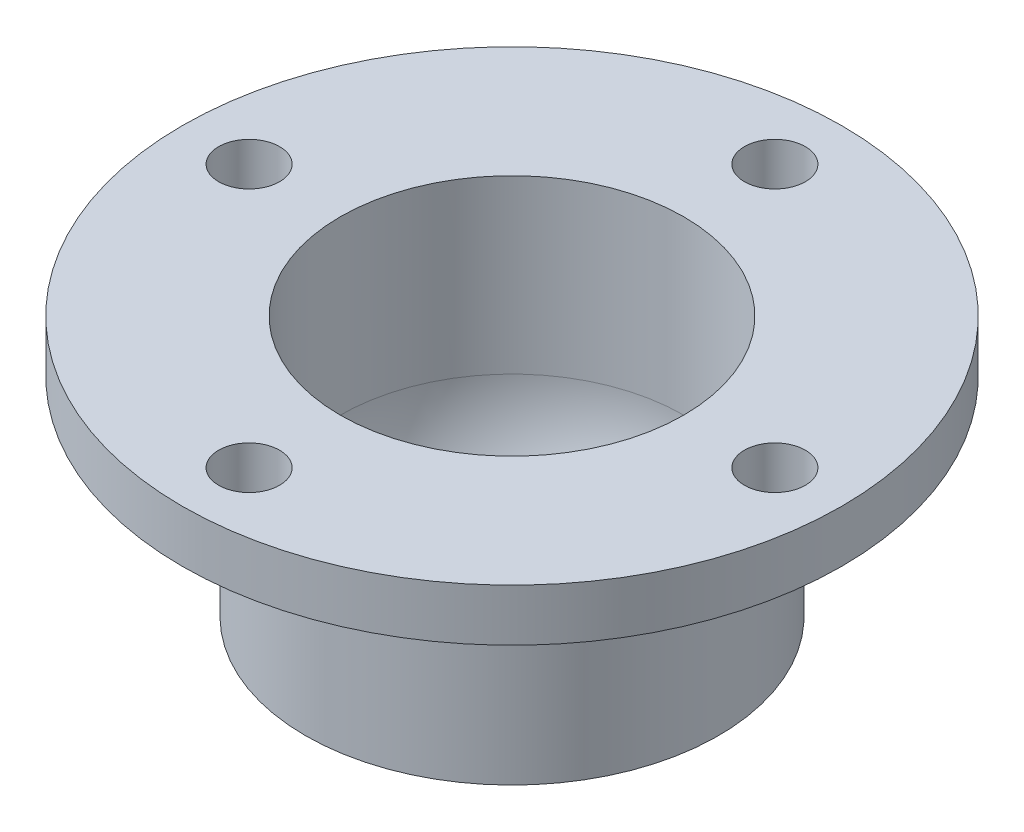
ISO-10303-21;
HEADER;
FILE_DESCRIPTION(('STEP AP214'),'2;1');
FILE_NAME('part.step','',(''),(''),'','','');
FILE_SCHEMA(('AUTOMOTIVE_DESIGN { 1 0 10303 214 1 1 1 1 }'));
ENDSEC;
DATA;
#1=APPLICATION_CONTEXT('core data for automotive mechanical design processes');
#2=APPLICATION_PROTOCOL_DEFINITION('international standard','automotive_design',2000,#1);
#3=PRODUCT_CONTEXT('',#1,'mechanical');
#4=PRODUCT('Part','Part','',(#3));
#5=PRODUCT_RELATED_PRODUCT_CATEGORY('part','',(#4));
#6=PRODUCT_DEFINITION_FORMATION('','',#4);
#7=PRODUCT_DEFINITION_CONTEXT('part definition',#1,'design');
#8=PRODUCT_DEFINITION('design','',#6,#7);
#9=PRODUCT_DEFINITION_SHAPE('','',#8);
#10=(LENGTH_UNIT() NAMED_UNIT(*) SI_UNIT(.MILLI.,.METRE.));
#11=(NAMED_UNIT(*) PLANE_ANGLE_UNIT() SI_UNIT($,.RADIAN.));
#12=(NAMED_UNIT(*) SI_UNIT($,.STERADIAN.) SOLID_ANGLE_UNIT());
#13=UNCERTAINTY_MEASURE_WITH_UNIT(LENGTH_MEASURE(1.E-05),#10,'distance_accuracy_value','');
#14=(GEOMETRIC_REPRESENTATION_CONTEXT(3) GLOBAL_UNCERTAINTY_ASSIGNED_CONTEXT((#13)) GLOBAL_UNIT_ASSIGNED_CONTEXT((#10,
#11,#12)) REPRESENTATION_CONTEXT('',''));
#15=CARTESIAN_POINT('',(0.,0.,0.));
#16=DIRECTION('',(0.,0.,1.));
#17=DIRECTION('',(1.,0.,0.));
#18=AXIS2_PLACEMENT_3D('',#15,#16,#17);
#19=CARTESIAN_POINT('',(0.,15.,0.));
#20=DIRECTION('',(0.,-1.,0.));
#21=DIRECTION('',(0.,0.,-1.));
#22=AXIS2_PLACEMENT_3D('',#19,#20,#21);
#23=CYLINDRICAL_SURFACE('',#22,11.9);
#24=CARTESIAN_POINT('',(0.,0.,0.));
#25=DIRECTION('',(0.,1.,0.));
#26=DIRECTION('',(0.,0.,1.));
#27=AXIS2_PLACEMENT_3D('',#24,#25,#26);
#28=CIRCLE('',#27,11.9);
#29=CARTESIAN_POINT('',(0.,0.,11.9));
#30=VERTEX_POINT('',#29);
#31=EDGE_CURVE('E45',#30,#30,#28,.T.);
#32=ORIENTED_EDGE('',*,*,#31,.T.);
#33=EDGE_LOOP('',(#32));
#34=FACE_BOUND('',#33,.T.);
#35=CARTESIAN_POINT('',(0.,12.,0.));
#36=DIRECTION('',(0.,1.,0.));
#37=DIRECTION('',(0.,0.,1.));
#38=AXIS2_PLACEMENT_3D('',#35,#36,#37);
#39=CIRCLE('',#38,11.9);
#40=CARTESIAN_POINT('',(0.,12.,11.9));
#41=VERTEX_POINT('',#40);
#42=EDGE_CURVE('E11',#41,#41,#39,.T.);
#43=ORIENTED_EDGE('',*,*,#42,.F.);
#44=EDGE_LOOP('',(#43));
#45=FACE_BOUND('',#44,.T.);
#46=ADVANCED_FACE('F39',(#34,#45),#23,.T.);
#47=CARTESIAN_POINT('',(0.,0.,0.));
#48=DIRECTION('',(0.,1.,0.));
#49=DIRECTION('',(0.,0.,1.));
#50=AXIS2_PLACEMENT_3D('',#47,#48,#49);
#51=PLANE('',#50);
#52=ORIENTED_EDGE('',*,*,#31,.F.);
#53=EDGE_LOOP('',(#52));
#54=FACE_BOUND('',#53,.T.);
#55=CARTESIAN_POINT('',(0.,0.,0.));
#56=DIRECTION('',(0.,1.,0.));
#57=DIRECTION('',(0.,0.,1.));
#58=AXIS2_PLACEMENT_3D('',#55,#56,#57);
#59=CIRCLE('',#58,8.48528137423857);
#60=CARTESIAN_POINT('',(0.,0.,8.48528137423857));
#61=VERTEX_POINT('',#60);
#62=EDGE_CURVE('E53',#61,#61,#59,.F.);
#63=ORIENTED_EDGE('',*,*,#62,.F.);
#64=EDGE_LOOP('',(#63));
#65=FACE_BOUND('',#64,.T.);
#66=ADVANCED_FACE('F131',(#54,#65),#51,.F.);
#67=CARTESIAN_POINT('',(0.,15.,0.));
#68=DIRECTION('',(0.,-1.,0.));
#69=DIRECTION('',(0.,0.,-1.));
#70=AXIS2_PLACEMENT_3D('',#67,#68,#69);
#71=CYLINDRICAL_SURFACE('',#70,9.9);
#72=CARTESIAN_POINT('',(0.,15.,0.));
#73=DIRECTION('',(0.,1.,0.));
#74=DIRECTION('',(0.,0.,1.));
#75=AXIS2_PLACEMENT_3D('',#72,#73,#74);
#76=CIRCLE('',#75,9.9);
#77=CARTESIAN_POINT('',(0.,15.,9.9));
#78=VERTEX_POINT('',#77);
#79=EDGE_CURVE('E49',#78,#78,#76,.T.);
#80=ORIENTED_EDGE('',*,*,#79,.T.);
#81=EDGE_LOOP('',(#80));
#82=FACE_BOUND('',#81,.T.);
#83=CARTESIAN_POINT('',(0.,5.1,0.));
#84=DIRECTION('',(0.,-1.,0.));
#85=DIRECTION('',(0.,0.,-1.));
#86=AXIS2_PLACEMENT_3D('',#83,#84,#85);
#87=CIRCLE('',#86,9.9);
#88=CARTESIAN_POINT('',(0.,5.1,-9.9));
#89=VERTEX_POINT('',#88);
#90=EDGE_CURVE('E58',#89,#89,#87,.F.);
#91=ORIENTED_EDGE('',*,*,#90,.F.);
#92=EDGE_LOOP('',(#91));
#93=FACE_BOUND('',#92,.T.);
#94=ADVANCED_FACE('F106',(#82,#93),#71,.F.);
#95=CARTESIAN_POINT('',(0.,15.,0.));
#96=DIRECTION('',(0.,1.,0.));
#97=DIRECTION('',(0.,0.,1.));
#98=AXIS2_PLACEMENT_3D('',#95,#96,#97);
#99=PLANE('',#98);
#100=CARTESIAN_POINT('',(15.15,15.,0.));
#101=DIRECTION('',(0.,1.,0.));
#102=DIRECTION('',(0.,0.,1.));
#103=AXIS2_PLACEMENT_3D('',#100,#101,#102);
#104=CIRCLE('',#103,1.755);
#105=CARTESIAN_POINT('',(15.15,15.,1.755));
#106=VERTEX_POINT('',#105);
#107=EDGE_CURVE('E86',#106,#106,#104,.T.);
#108=ORIENTED_EDGE('',*,*,#107,.F.);
#109=EDGE_LOOP('',(#108));
#110=FACE_BOUND('',#109,.T.);
#111=CARTESIAN_POINT('',(0.,15.,15.15));
#112=DIRECTION('',(0.,1.,0.));
#113=DIRECTION('',(0.,0.,1.));
#114=AXIS2_PLACEMENT_3D('',#111,#112,#113);
#115=CIRCLE('',#114,1.755);
#116=CARTESIAN_POINT('',(0.,15.,16.905));
#117=VERTEX_POINT('',#116);
#118=EDGE_CURVE('E80',#117,#117,#115,.T.);
#119=ORIENTED_EDGE('',*,*,#118,.F.);
#120=EDGE_LOOP('',(#119));
#121=FACE_BOUND('',#120,.T.);
#122=CARTESIAN_POINT('',(-15.15,15.,0.));
#123=DIRECTION('',(0.,1.,0.));
#124=DIRECTION('',(0.,0.,1.));
#125=AXIS2_PLACEMENT_3D('',#122,#123,#124);
#126=CIRCLE('',#125,1.755);
#127=CARTESIAN_POINT('',(-15.15,15.,1.755));
#128=VERTEX_POINT('',#127);
#129=EDGE_CURVE('E74',#128,#128,#126,.T.);
#130=ORIENTED_EDGE('',*,*,#129,.F.);
#131=EDGE_LOOP('',(#130));
#132=FACE_BOUND('',#131,.T.);
#133=CARTESIAN_POINT('',(0.,15.,-15.15));
#134=DIRECTION('',(0.,1.,0.));
#135=DIRECTION('',(0.,0.,1.));
#136=AXIS2_PLACEMENT_3D('',#133,#134,#135);
#137=CIRCLE('',#136,1.755);
#138=CARTESIAN_POINT('',(0.,15.,-13.395));
#139=VERTEX_POINT('',#138);
#140=EDGE_CURVE('E68',#139,#139,#137,.T.);
#141=ORIENTED_EDGE('',*,*,#140,.F.);
#142=EDGE_LOOP('',(#141));
#143=FACE_BOUND('',#142,.T.);
#144=ORIENTED_EDGE('',*,*,#79,.F.);
#145=EDGE_LOOP('',(#144));
#146=FACE_BOUND('',#145,.T.);
#147=CARTESIAN_POINT('',(0.,15.,0.));
#148=DIRECTION('',(0.,1.,0.));
#149=DIRECTION('',(0.,0.,1.));
#150=AXIS2_PLACEMENT_3D('',#147,#148,#149);
#151=CIRCLE('',#150,19.);
#152=CARTESIAN_POINT('',(0.,15.,19.));
#153=VERTEX_POINT('',#152);
#154=EDGE_CURVE('E62',#153,#153,#151,.T.);
#155=ORIENTED_EDGE('',*,*,#154,.T.);
#156=EDGE_LOOP('',(#155));
#157=FACE_BOUND('',#156,.T.);
#158=ADVANCED_FACE('F102',(#110,#121,#132,#143,#146,#157),#99,.T.);
#159=CARTESIAN_POINT('',(0.,5.1,0.));
#160=DIRECTION('',(0.,1.,0.));
#161=DIRECTION('',(0.,0.,-1.));
#162=AXIS2_PLACEMENT_3D('',#159,#160,#161);
#163=SPHERICAL_SURFACE('',#162,9.9);
#164=ORIENTED_EDGE('',*,*,#90,.T.);
#165=EDGE_LOOP('',(#164));
#166=FACE_BOUND('',#165,.T.);
#167=ORIENTED_EDGE('',*,*,#62,.T.);
#168=EDGE_LOOP('',(#167));
#169=FACE_BOUND('',#168,.T.);
#170=ADVANCED_FACE('F105',(#166,#169),#163,.F.);
#171=CARTESIAN_POINT('',(0.,12.,0.));
#172=DIRECTION('',(0.,1.,0.));
#173=DIRECTION('',(0.,0.,1.));
#174=AXIS2_PLACEMENT_3D('',#171,#172,#173);
#175=CYLINDRICAL_SURFACE('',#174,19.);
#176=CARTESIAN_POINT('',(0.,12.,0.));
#177=DIRECTION('',(0.,1.,0.));
#178=DIRECTION('',(0.,0.,1.));
#179=AXIS2_PLACEMENT_3D('',#176,#177,#178);
#180=CIRCLE('',#179,19.);
#181=CARTESIAN_POINT('',(0.,12.,19.));
#182=VERTEX_POINT('',#181);
#183=EDGE_CURVE('E61',#182,#182,#180,.T.);
#184=ORIENTED_EDGE('',*,*,#183,.T.);
#185=EDGE_LOOP('',(#184));
#186=FACE_BOUND('',#185,.T.);
#187=ORIENTED_EDGE('',*,*,#154,.F.);
#188=EDGE_LOOP('',(#187));
#189=FACE_BOUND('',#188,.T.);
#190=ADVANCED_FACE('F118',(#186,#189),#175,.T.);
#191=CARTESIAN_POINT('',(0.,12.,0.));
#192=DIRECTION('',(0.,1.,0.));
#193=DIRECTION('',(0.,0.,1.));
#194=AXIS2_PLACEMENT_3D('',#191,#192,#193);
#195=PLANE('',#194);
#196=CARTESIAN_POINT('',(15.15,12.,0.));
#197=DIRECTION('',(0.,1.,0.));
#198=DIRECTION('',(0.,0.,1.));
#199=AXIS2_PLACEMENT_3D('',#196,#197,#198);
#200=CIRCLE('',#199,1.755);
#201=CARTESIAN_POINT('',(15.15,12.,1.755));
#202=VERTEX_POINT('',#201);
#203=EDGE_CURVE('E83',#202,#202,#200,.T.);
#204=ORIENTED_EDGE('',*,*,#203,.T.);
#205=EDGE_LOOP('',(#204));
#206=FACE_BOUND('',#205,.T.);
#207=CARTESIAN_POINT('',(0.,12.,15.15));
#208=DIRECTION('',(0.,1.,0.));
#209=DIRECTION('',(0.,0.,1.));
#210=AXIS2_PLACEMENT_3D('',#207,#208,#209);
#211=CIRCLE('',#210,1.755);
#212=CARTESIAN_POINT('',(0.,12.,16.905));
#213=VERTEX_POINT('',#212);
#214=EDGE_CURVE('E77',#213,#213,#211,.T.);
#215=ORIENTED_EDGE('',*,*,#214,.T.);
#216=EDGE_LOOP('',(#215));
#217=FACE_BOUND('',#216,.T.);
#218=CARTESIAN_POINT('',(-15.15,12.,0.));
#219=DIRECTION('',(0.,1.,0.));
#220=DIRECTION('',(0.,0.,1.));
#221=AXIS2_PLACEMENT_3D('',#218,#219,#220);
#222=CIRCLE('',#221,1.755);
#223=CARTESIAN_POINT('',(-15.15,12.,1.755));
#224=VERTEX_POINT('',#223);
#225=EDGE_CURVE('E71',#224,#224,#222,.T.);
#226=ORIENTED_EDGE('',*,*,#225,.T.);
#227=EDGE_LOOP('',(#226));
#228=FACE_BOUND('',#227,.T.);
#229=CARTESIAN_POINT('',(0.,12.,-15.15));
#230=DIRECTION('',(0.,1.,0.));
#231=DIRECTION('',(0.,0.,1.));
#232=AXIS2_PLACEMENT_3D('',#229,#230,#231);
#233=CIRCLE('',#232,1.755);
#234=CARTESIAN_POINT('',(0.,12.,-13.395));
#235=VERTEX_POINT('',#234);
#236=EDGE_CURVE('E65',#235,#235,#233,.T.);
#237=ORIENTED_EDGE('',*,*,#236,.T.);
#238=EDGE_LOOP('',(#237));
#239=FACE_BOUND('',#238,.T.);
#240=ORIENTED_EDGE('',*,*,#42,.T.);
#241=EDGE_LOOP('',(#240));
#242=FACE_BOUND('',#241,.T.);
#243=ORIENTED_EDGE('',*,*,#183,.F.);
#244=EDGE_LOOP('',(#243));
#245=FACE_BOUND('',#244,.T.);
#246=ADVANCED_FACE('F92',(#206,#217,#228,#239,#242,#245),#195,.F.);
#247=CARTESIAN_POINT('',(0.,12.,-15.15));
#248=DIRECTION('',(0.,1.,0.));
#249=DIRECTION('',(0.,0.,1.));
#250=AXIS2_PLACEMENT_3D('',#247,#248,#249);
#251=CYLINDRICAL_SURFACE('',#250,1.755);
#252=ORIENTED_EDGE('',*,*,#236,.F.);
#253=EDGE_LOOP('',(#252));
#254=FACE_BOUND('',#253,.T.);
#255=ORIENTED_EDGE('',*,*,#140,.T.);
#256=EDGE_LOOP('',(#255));
#257=FACE_BOUND('',#256,.T.);
#258=ADVANCED_FACE('F126',(#254,#257),#251,.F.);
#259=CARTESIAN_POINT('',(-15.15,12.,0.));
#260=DIRECTION('',(0.,1.,0.));
#261=DIRECTION('',(0.,0.,1.));
#262=AXIS2_PLACEMENT_3D('',#259,#260,#261);
#263=CYLINDRICAL_SURFACE('',#262,1.755);
#264=ORIENTED_EDGE('',*,*,#225,.F.);
#265=EDGE_LOOP('',(#264));
#266=FACE_BOUND('',#265,.T.);
#267=ORIENTED_EDGE('',*,*,#129,.T.);
#268=EDGE_LOOP('',(#267));
#269=FACE_BOUND('',#268,.T.);
#270=ADVANCED_FACE('F185',(#266,#269),#263,.F.);
#271=CARTESIAN_POINT('',(0.,12.,15.15));
#272=DIRECTION('',(0.,1.,0.));
#273=DIRECTION('',(0.,0.,1.));
#274=AXIS2_PLACEMENT_3D('',#271,#272,#273);
#275=CYLINDRICAL_SURFACE('',#274,1.755);
#276=ORIENTED_EDGE('',*,*,#214,.F.);
#277=EDGE_LOOP('',(#276));
#278=FACE_BOUND('',#277,.T.);
#279=ORIENTED_EDGE('',*,*,#118,.T.);
#280=EDGE_LOOP('',(#279));
#281=FACE_BOUND('',#280,.T.);
#282=ADVANCED_FACE('F98',(#278,#281),#275,.F.);
#283=CARTESIAN_POINT('',(15.15,12.,0.));
#284=DIRECTION('',(0.,1.,0.));
#285=DIRECTION('',(0.,0.,1.));
#286=AXIS2_PLACEMENT_3D('',#283,#284,#285);
#287=CYLINDRICAL_SURFACE('',#286,1.755);
#288=ORIENTED_EDGE('',*,*,#203,.F.);
#289=EDGE_LOOP('',(#288));
#290=FACE_BOUND('',#289,.T.);
#291=ORIENTED_EDGE('',*,*,#107,.T.);
#292=EDGE_LOOP('',(#291));
#293=FACE_BOUND('',#292,.T.);
#294=ADVANCED_FACE('F95',(#290,#293),#287,.F.);
#295=CLOSED_SHELL('',(#46,#66,#94,#158,#170,#190,#246,#258,#270,#282,#294));
#296=MANIFOLD_SOLID_BREP('B2',#295);
#297=ADVANCED_BREP_SHAPE_REPRESENTATION('',(#18,#296),#14);
#298=SHAPE_DEFINITION_REPRESENTATION(#9,#297);
ENDSEC;
END-ISO-10303-21;
